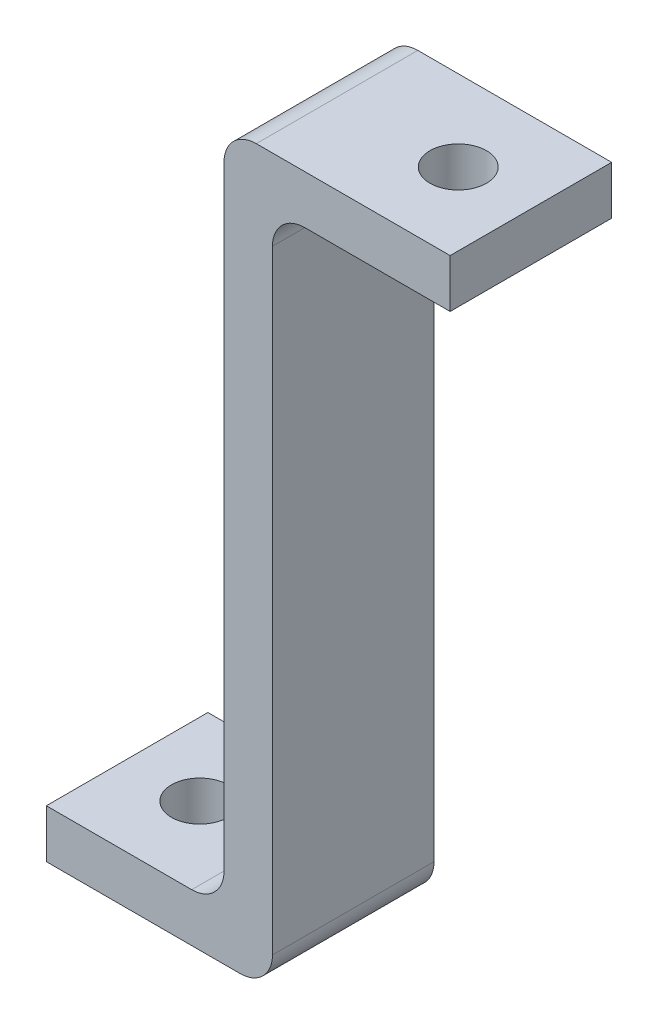
ISO-10303-21;
HEADER;
FILE_DESCRIPTION(('STEP AP214'),'2;1');
FILE_NAME('part.step','',(''),(''),'','','');
FILE_SCHEMA(('AUTOMOTIVE_DESIGN { 1 0 10303 214 1 1 1 1 }'));
ENDSEC;
DATA;
#1=APPLICATION_CONTEXT('core data for automotive mechanical design processes');
#2=APPLICATION_PROTOCOL_DEFINITION('international standard','automotive_design',2000,#1);
#3=PRODUCT_CONTEXT('',#1,'mechanical');
#4=PRODUCT('Part','Part','',(#3));
#5=PRODUCT_RELATED_PRODUCT_CATEGORY('part','',(#4));
#6=PRODUCT_DEFINITION_FORMATION('','',#4);
#7=PRODUCT_DEFINITION_CONTEXT('part definition',#1,'design');
#8=PRODUCT_DEFINITION('design','',#6,#7);
#9=PRODUCT_DEFINITION_SHAPE('','',#8);
#10=(LENGTH_UNIT() NAMED_UNIT(*) SI_UNIT(.MILLI.,.METRE.));
#11=(NAMED_UNIT(*) PLANE_ANGLE_UNIT() SI_UNIT($,.RADIAN.));
#12=(NAMED_UNIT(*) SI_UNIT($,.STERADIAN.) SOLID_ANGLE_UNIT());
#13=UNCERTAINTY_MEASURE_WITH_UNIT(LENGTH_MEASURE(1.E-05),#10,'distance_accuracy_value','');
#14=(GEOMETRIC_REPRESENTATION_CONTEXT(3) GLOBAL_UNCERTAINTY_ASSIGNED_CONTEXT((#13)) GLOBAL_UNIT_ASSIGNED_CONTEXT((#10,
#11,#12)) REPRESENTATION_CONTEXT('',''));
#15=CARTESIAN_POINT('',(0.,0.,0.));
#16=DIRECTION('',(0.,0.,1.));
#17=DIRECTION('',(1.,0.,0.));
#18=AXIS2_PLACEMENT_3D('',#15,#16,#17);
#19=CARTESIAN_POINT('',(0.,3.,-10.));
#20=DIRECTION('',(-1.,0.,0.));
#21=DIRECTION('',(0.,-1.,0.));
#22=AXIS2_PLACEMENT_3D('',#19,#20,#21);
#23=PLANE('',#22);
#24=DIRECTION('',(0.,-1.,0.));
#25=VECTOR('',#24,1.);
#26=CARTESIAN_POINT('',(0.,3.,0.));
#27=LINE('',#26,#25);
#28=CARTESIAN_POINT('',(0.,3.,0.));
#29=VERTEX_POINT('',#28);
#30=CARTESIAN_POINT('',(0.,0.,0.));
#31=VERTEX_POINT('',#30);
#32=EDGE_CURVE('E189',#29,#31,#27,.T.);
#33=ORIENTED_EDGE('',*,*,#32,.F.);
#34=DIRECTION('',(0.,0.,1.));
#35=VECTOR('',#34,1.);
#36=CARTESIAN_POINT('',(0.,3.,-10.));
#37=LINE('',#36,#35);
#38=CARTESIAN_POINT('',(0.,3.,-10.));
#39=VERTEX_POINT('',#38);
#40=EDGE_CURVE('E159',#39,#29,#37,.T.);
#41=ORIENTED_EDGE('',*,*,#40,.F.);
#42=DIRECTION('',(0.,-1.,0.));
#43=VECTOR('',#42,1.);
#44=CARTESIAN_POINT('',(0.,3.,-10.));
#45=LINE('',#44,#43);
#46=CARTESIAN_POINT('',(0.,0.,-10.));
#47=VERTEX_POINT('',#46);
#48=EDGE_CURVE('E151',#39,#47,#45,.T.);
#49=ORIENTED_EDGE('',*,*,#48,.T.);
#50=DIRECTION('',(0.,0.,1.));
#51=VECTOR('',#50,1.);
#52=CARTESIAN_POINT('',(0.,0.,-10.));
#53=LINE('',#52,#51);
#54=EDGE_CURVE('E131',#47,#31,#53,.T.);
#55=ORIENTED_EDGE('',*,*,#54,.T.);
#56=EDGE_LOOP('',(#33,#41,#49,#55));
#57=FACE_BOUND('',#56,.T.);
#58=ADVANCED_FACE('F39',(#57),#23,.T.);
#59=CARTESIAN_POINT('',(11.,3.,-10.));
#60=DIRECTION('',(0.,1.,0.));
#61=DIRECTION('',(-1.,0.,0.));
#62=AXIS2_PLACEMENT_3D('',#59,#60,#61);
#63=PLANE('',#62);
#64=CARTESIAN_POINT('',(4.5,3.,-5.));
#65=DIRECTION('',(0.,1.,0.));
#66=DIRECTION('',(-1.,0.,0.));
#67=AXIS2_PLACEMENT_3D('',#64,#65,#66);
#68=CIRCLE('',#67,1.75);
#69=CARTESIAN_POINT('',(2.75,3.,-5.));
#70=VERTEX_POINT('',#69);
#71=EDGE_CURVE('E167',#70,#70,#68,.T.);
#72=ORIENTED_EDGE('',*,*,#71,.F.);
#73=EDGE_LOOP('',(#72));
#74=FACE_BOUND('',#73,.T.);
#75=DIRECTION('',(-1.,0.,0.));
#76=VECTOR('',#75,1.);
#77=CARTESIAN_POINT('',(11.,3.,0.));
#78=LINE('',#77,#76);
#79=CARTESIAN_POINT('',(9.,3.,0.));
#80=VERTEX_POINT('',#79);
#81=EDGE_CURVE('E161',#80,#29,#78,.T.);
#82=ORIENTED_EDGE('',*,*,#81,.F.);
#83=DIRECTION('',(0.,0.,1.));
#84=VECTOR('',#83,1.);
#85=CARTESIAN_POINT('',(9.,3.,-10.));
#86=LINE('',#85,#84);
#87=CARTESIAN_POINT('',(9.,3.,-10.));
#88=VERTEX_POINT('',#87);
#89=EDGE_CURVE('E251',#80,#88,#86,.F.);
#90=ORIENTED_EDGE('',*,*,#89,.T.);
#91=DIRECTION('',(-1.,0.,0.));
#92=VECTOR('',#91,1.);
#93=CARTESIAN_POINT('',(11.,3.,-10.));
#94=LINE('',#93,#92);
#95=EDGE_CURVE('E145',#88,#39,#94,.T.);
#96=ORIENTED_EDGE('',*,*,#95,.T.);
#97=ORIENTED_EDGE('',*,*,#40,.T.);
#98=EDGE_LOOP('',(#82,#90,#96,#97));
#99=FACE_BOUND('',#98,.T.);
#100=ADVANCED_FACE('F280',(#74,#99),#63,.T.);
#101=CARTESIAN_POINT('',(11.,45.,-10.));
#102=DIRECTION('',(-1.,0.,0.));
#103=DIRECTION('',(0.,-1.,0.));
#104=AXIS2_PLACEMENT_3D('',#101,#102,#103);
#105=PLANE('',#104);
#106=DIRECTION('',(0.,-1.,0.));
#107=VECTOR('',#106,1.);
#108=CARTESIAN_POINT('',(11.,45.,0.));
#109=LINE('',#108,#107);
#110=CARTESIAN_POINT('',(11.,43.,0.));
#111=VERTEX_POINT('',#110);
#112=CARTESIAN_POINT('',(11.,5.00000000000001,0.));
#113=VERTEX_POINT('',#112);
#114=EDGE_CURVE('E164',#111,#113,#109,.T.);
#115=ORIENTED_EDGE('',*,*,#114,.F.);
#116=DIRECTION('',(0.,0.,1.));
#117=VECTOR('',#116,1.);
#118=CARTESIAN_POINT('',(11.,43.,-10.));
#119=LINE('',#118,#117);
#120=CARTESIAN_POINT('',(11.,43.,-10.));
#121=VERTEX_POINT('',#120);
#122=EDGE_CURVE('E248',#111,#121,#119,.F.);
#123=ORIENTED_EDGE('',*,*,#122,.T.);
#124=DIRECTION('',(0.,-1.,0.));
#125=VECTOR('',#124,1.);
#126=CARTESIAN_POINT('',(11.,45.,-10.));
#127=LINE('',#126,#125);
#128=CARTESIAN_POINT('',(11.,5.00000000000001,-10.));
#129=VERTEX_POINT('',#128);
#130=EDGE_CURVE('E183',#121,#129,#127,.T.);
#131=ORIENTED_EDGE('',*,*,#130,.T.);
#132=DIRECTION('',(0.,0.,1.));
#133=VECTOR('',#132,1.);
#134=CARTESIAN_POINT('',(11.,5.,0.));
#135=LINE('',#134,#133);
#136=EDGE_CURVE('E244',#129,#113,#135,.T.);
#137=ORIENTED_EDGE('',*,*,#136,.T.);
#138=EDGE_LOOP('',(#115,#123,#131,#137));
#139=FACE_BOUND('',#138,.T.);
#140=ADVANCED_FACE('F287',(#139),#105,.T.);
#141=CARTESIAN_POINT('',(25.,45.,-10.));
#142=DIRECTION('',(0.,1.,0.));
#143=DIRECTION('',(-1.,0.,0.));
#144=AXIS2_PLACEMENT_3D('',#141,#142,#143);
#145=PLANE('',#144);
#146=CARTESIAN_POINT('',(20.5,45.,-5.));
#147=DIRECTION('',(0.,1.,0.));
#148=DIRECTION('',(0.,0.,1.));
#149=AXIS2_PLACEMENT_3D('',#146,#147,#148);
#150=CIRCLE('',#149,1.74999999999999);
#151=CARTESIAN_POINT('',(20.5,45.,-3.25000000000001));
#152=VERTEX_POINT('',#151);
#153=EDGE_CURVE('E441',#152,#152,#150,.T.);
#154=ORIENTED_EDGE('',*,*,#153,.F.);
#155=EDGE_LOOP('',(#154));
#156=FACE_BOUND('',#155,.T.);
#157=DIRECTION('',(-1.,0.,0.));
#158=VECTOR('',#157,1.);
#159=CARTESIAN_POINT('',(25.,45.,-10.));
#160=LINE('',#159,#158);
#161=CARTESIAN_POINT('',(25.,45.,-10.));
#162=VERTEX_POINT('',#161);
#163=CARTESIAN_POINT('',(13.,45.,-10.));
#164=VERTEX_POINT('',#163);
#165=EDGE_CURVE('E180',#162,#164,#160,.T.);
#166=ORIENTED_EDGE('',*,*,#165,.T.);
#167=DIRECTION('',(0.,0.,1.));
#168=VECTOR('',#167,1.);
#169=CARTESIAN_POINT('',(13.,45.,-10.));
#170=LINE('',#169,#168);
#171=CARTESIAN_POINT('',(13.,45.,0.));
#172=VERTEX_POINT('',#171);
#173=EDGE_CURVE('E240',#164,#172,#170,.T.);
#174=ORIENTED_EDGE('',*,*,#173,.T.);
#175=DIRECTION('',(-1.,0.,0.));
#176=VECTOR('',#175,1.);
#177=CARTESIAN_POINT('',(25.,45.,0.));
#178=LINE('',#177,#176);
#179=CARTESIAN_POINT('',(25.,45.,0.));
#180=VERTEX_POINT('',#179);
#181=EDGE_CURVE('E205',#180,#172,#178,.T.);
#182=ORIENTED_EDGE('',*,*,#181,.F.);
#183=DIRECTION('',(0.,0.,1.));
#184=VECTOR('',#183,1.);
#185=CARTESIAN_POINT('',(25.,45.,-10.));
#186=LINE('',#185,#184);
#187=EDGE_CURVE('E215',#162,#180,#186,.T.);
#188=ORIENTED_EDGE('',*,*,#187,.F.);
#189=EDGE_LOOP('',(#166,#174,#182,#188));
#190=FACE_BOUND('',#189,.T.);
#191=ADVANCED_FACE('F294',(#156,#190),#145,.T.);
#192=CARTESIAN_POINT('',(25.,42.,-10.));
#193=DIRECTION('',(1.,0.,0.));
#194=DIRECTION('',(0.,1.,0.));
#195=AXIS2_PLACEMENT_3D('',#192,#193,#194);
#196=PLANE('',#195);
#197=DIRECTION('',(0.,1.,0.));
#198=VECTOR('',#197,1.);
#199=CARTESIAN_POINT('',(25.,42.,0.));
#200=LINE('',#199,#198);
#201=CARTESIAN_POINT('',(25.,42.,0.));
#202=VERTEX_POINT('',#201);
#203=EDGE_CURVE('E201',#202,#180,#200,.T.);
#204=ORIENTED_EDGE('',*,*,#203,.F.);
#205=DIRECTION('',(0.,0.,1.));
#206=VECTOR('',#205,1.);
#207=CARTESIAN_POINT('',(25.,42.,-10.));
#208=LINE('',#207,#206);
#209=CARTESIAN_POINT('',(25.,42.,-10.));
#210=VERTEX_POINT('',#209);
#211=EDGE_CURVE('E144',#210,#202,#208,.T.);
#212=ORIENTED_EDGE('',*,*,#211,.F.);
#213=DIRECTION('',(0.,1.,0.));
#214=VECTOR('',#213,1.);
#215=CARTESIAN_POINT('',(25.,42.,-10.));
#216=LINE('',#215,#214);
#217=EDGE_CURVE('E176',#210,#162,#216,.T.);
#218=ORIENTED_EDGE('',*,*,#217,.T.);
#219=ORIENTED_EDGE('',*,*,#187,.T.);
#220=EDGE_LOOP('',(#204,#212,#218,#219));
#221=FACE_BOUND('',#220,.T.);
#222=ADVANCED_FACE('F296',(#221),#196,.T.);
#223=CARTESIAN_POINT('',(14.,42.,-10.));
#224=DIRECTION('',(0.,-1.,0.));
#225=DIRECTION('',(0.,0.,-1.));
#226=AXIS2_PLACEMENT_3D('',#223,#224,#225);
#227=PLANE('',#226);
#228=CARTESIAN_POINT('',(20.5,42.,-5.));
#229=DIRECTION('',(0.,-1.,0.));
#230=DIRECTION('',(0.,0.,-1.));
#231=AXIS2_PLACEMENT_3D('',#228,#229,#230);
#232=CIRCLE('',#231,1.74999999999999);
#233=CARTESIAN_POINT('',(20.5,42.,-6.74999999999999));
#234=VERTEX_POINT('',#233);
#235=EDGE_CURVE('E437',#234,#234,#232,.T.);
#236=ORIENTED_EDGE('',*,*,#235,.F.);
#237=EDGE_LOOP('',(#236));
#238=FACE_BOUND('',#237,.T.);
#239=DIRECTION('',(1.,0.,0.));
#240=VECTOR('',#239,1.);
#241=CARTESIAN_POINT('',(14.,42.,0.));
#242=LINE('',#241,#240);
#243=CARTESIAN_POINT('',(16.,42.,0.));
#244=VERTEX_POINT('',#243);
#245=EDGE_CURVE('E198',#244,#202,#242,.T.);
#246=ORIENTED_EDGE('',*,*,#245,.F.);
#247=DIRECTION('',(0.,0.,1.));
#248=VECTOR('',#247,1.);
#249=CARTESIAN_POINT('',(16.,42.,-10.));
#250=LINE('',#249,#248);
#251=CARTESIAN_POINT('',(16.,42.,-10.));
#252=VERTEX_POINT('',#251);
#253=EDGE_CURVE('E55',#244,#252,#250,.F.);
#254=ORIENTED_EDGE('',*,*,#253,.T.);
#255=DIRECTION('',(1.,0.,0.));
#256=VECTOR('',#255,1.);
#257=CARTESIAN_POINT('',(14.,42.,-10.));
#258=LINE('',#257,#256);
#259=EDGE_CURVE('E173',#252,#210,#258,.T.);
#260=ORIENTED_EDGE('',*,*,#259,.T.);
#261=ORIENTED_EDGE('',*,*,#211,.T.);
#262=EDGE_LOOP('',(#246,#254,#260,#261));
#263=FACE_BOUND('',#262,.T.);
#264=ADVANCED_FACE('F267',(#238,#263),#227,.T.);
#265=CARTESIAN_POINT('',(14.,0.,-10.));
#266=DIRECTION('',(1.,0.,0.));
#267=DIRECTION('',(0.,0.,-1.));
#268=AXIS2_PLACEMENT_3D('',#265,#266,#267);
#269=PLANE('',#268);
#270=DIRECTION('',(0.,1.,0.));
#271=VECTOR('',#270,1.);
#272=CARTESIAN_POINT('',(14.,0.,0.));
#273=LINE('',#272,#271);
#274=CARTESIAN_POINT('',(14.,2.,0.));
#275=VERTEX_POINT('',#274);
#276=CARTESIAN_POINT('',(14.,40.,0.));
#277=VERTEX_POINT('',#276);
#278=EDGE_CURVE('E194',#275,#277,#273,.T.);
#279=ORIENTED_EDGE('',*,*,#278,.F.);
#280=DIRECTION('',(0.,0.,1.));
#281=VECTOR('',#280,1.);
#282=CARTESIAN_POINT('',(14.,2.,-10.));
#283=LINE('',#282,#281);
#284=CARTESIAN_POINT('',(14.,2.,-10.));
#285=VERTEX_POINT('',#284);
#286=EDGE_CURVE('E233',#275,#285,#283,.F.);
#287=ORIENTED_EDGE('',*,*,#286,.T.);
#288=DIRECTION('',(0.,1.,0.));
#289=VECTOR('',#288,1.);
#290=CARTESIAN_POINT('',(14.,0.,-10.));
#291=LINE('',#290,#289);
#292=CARTESIAN_POINT('',(14.,40.,-10.));
#293=VERTEX_POINT('',#292);
#294=EDGE_CURVE('E155',#285,#293,#291,.T.);
#295=ORIENTED_EDGE('',*,*,#294,.T.);
#296=DIRECTION('',(0.,0.,1.));
#297=VECTOR('',#296,1.);
#298=CARTESIAN_POINT('',(14.,40.,0.));
#299=LINE('',#298,#297);
#300=EDGE_CURVE('E229',#293,#277,#299,.T.);
#301=ORIENTED_EDGE('',*,*,#300,.T.);
#302=EDGE_LOOP('',(#279,#287,#295,#301));
#303=FACE_BOUND('',#302,.T.);
#304=ADVANCED_FACE('F273',(#303),#269,.T.);
#305=CARTESIAN_POINT('',(0.,0.,-10.));
#306=DIRECTION('',(0.,-1.,0.));
#307=DIRECTION('',(0.,0.,-1.));
#308=AXIS2_PLACEMENT_3D('',#305,#306,#307);
#309=PLANE('',#308);
#310=CARTESIAN_POINT('',(4.5,0.,-5.));
#311=DIRECTION('',(0.,-1.,0.));
#312=DIRECTION('',(0.,0.,-1.));
#313=AXIS2_PLACEMENT_3D('',#310,#311,#312);
#314=CIRCLE('',#313,1.75);
#315=CARTESIAN_POINT('',(4.5,0.,-6.75));
#316=VERTEX_POINT('',#315);
#317=EDGE_CURVE('E435',#316,#316,#314,.T.);
#318=ORIENTED_EDGE('',*,*,#317,.F.);
#319=EDGE_LOOP('',(#318));
#320=FACE_BOUND('',#319,.T.);
#321=DIRECTION('',(1.,0.,0.));
#322=VECTOR('',#321,1.);
#323=CARTESIAN_POINT('',(0.,0.,-10.));
#324=LINE('',#323,#322);
#325=CARTESIAN_POINT('',(12.,0.,-10.));
#326=VERTEX_POINT('',#325);
#327=EDGE_CURVE('E135',#47,#326,#324,.T.);
#328=ORIENTED_EDGE('',*,*,#327,.T.);
#329=DIRECTION('',(0.,0.,1.));
#330=VECTOR('',#329,1.);
#331=CARTESIAN_POINT('',(12.,0.,-10.));
#332=LINE('',#331,#330);
#333=CARTESIAN_POINT('',(12.,0.,0.));
#334=VERTEX_POINT('',#333);
#335=EDGE_CURVE('E214',#326,#334,#332,.T.);
#336=ORIENTED_EDGE('',*,*,#335,.T.);
#337=DIRECTION('',(1.,0.,0.));
#338=VECTOR('',#337,1.);
#339=CARTESIAN_POINT('',(0.,0.,0.));
#340=LINE('',#339,#338);
#341=EDGE_CURVE('E138',#31,#334,#340,.T.);
#342=ORIENTED_EDGE('',*,*,#341,.F.);
#343=ORIENTED_EDGE('',*,*,#54,.F.);
#344=EDGE_LOOP('',(#328,#336,#342,#343));
#345=FACE_BOUND('',#344,.T.);
#346=ADVANCED_FACE('F133',(#320,#345),#309,.T.);
#347=CARTESIAN_POINT('',(0.,0.,-10.));
#348=DIRECTION('',(0.,0.,1.));
#349=DIRECTION('',(1.,0.,0.));
#350=AXIS2_PLACEMENT_3D('',#347,#348,#349);
#351=PLANE('',#350);
#352=ORIENTED_EDGE('',*,*,#294,.F.);
#353=CARTESIAN_POINT('',(12.,2.,-10.));
#354=DIRECTION('',(0.,0.,1.));
#355=DIRECTION('',(1.,0.,0.));
#356=AXIS2_PLACEMENT_3D('',#353,#354,#355);
#357=CIRCLE('',#356,2.);
#358=EDGE_CURVE('E153',#285,#326,#357,.F.);
#359=ORIENTED_EDGE('',*,*,#358,.T.);
#360=ORIENTED_EDGE('',*,*,#327,.F.);
#361=ORIENTED_EDGE('',*,*,#48,.F.);
#362=ORIENTED_EDGE('',*,*,#95,.F.);
#363=CARTESIAN_POINT('',(9.,5.,-10.));
#364=DIRECTION('',(0.,0.,1.));
#365=DIRECTION('',(1.,0.,0.));
#366=AXIS2_PLACEMENT_3D('',#363,#364,#365);
#367=CIRCLE('',#366,2.);
#368=EDGE_CURVE('E259',#88,#129,#367,.T.);
#369=ORIENTED_EDGE('',*,*,#368,.T.);
#370=ORIENTED_EDGE('',*,*,#130,.F.);
#371=CARTESIAN_POINT('',(13.,43.,-10.));
#372=DIRECTION('',(0.,0.,1.));
#373=DIRECTION('',(1.,0.,0.));
#374=AXIS2_PLACEMENT_3D('',#371,#372,#373);
#375=CIRCLE('',#374,2.);
#376=EDGE_CURVE('E63',#121,#164,#375,.F.);
#377=ORIENTED_EDGE('',*,*,#376,.T.);
#378=ORIENTED_EDGE('',*,*,#165,.F.);
#379=ORIENTED_EDGE('',*,*,#217,.F.);
#380=ORIENTED_EDGE('',*,*,#259,.F.);
#381=CARTESIAN_POINT('',(16.,40.,-10.));
#382=DIRECTION('',(0.,0.,1.));
#383=DIRECTION('',(1.,0.,0.));
#384=AXIS2_PLACEMENT_3D('',#381,#382,#383);
#385=CIRCLE('',#384,2.);
#386=EDGE_CURVE('E11',#252,#293,#385,.T.);
#387=ORIENTED_EDGE('',*,*,#386,.T.);
#388=EDGE_LOOP('',(#352,#359,#360,#361,#362,#369,#370,#377,#378,#379,#380,#387));
#389=FACE_BOUND('',#388,.T.);
#390=ADVANCED_FACE('F149',(#389),#351,.F.);
#391=CARTESIAN_POINT('',(0.,0.,0.));
#392=DIRECTION('',(0.,0.,1.));
#393=DIRECTION('',(1.,0.,0.));
#394=AXIS2_PLACEMENT_3D('',#391,#392,#393);
#395=PLANE('',#394);
#396=ORIENTED_EDGE('',*,*,#341,.T.);
#397=CARTESIAN_POINT('',(12.,2.,0.));
#398=DIRECTION('',(0.,0.,1.));
#399=DIRECTION('',(1.,0.,0.));
#400=AXIS2_PLACEMENT_3D('',#397,#398,#399);
#401=CIRCLE('',#400,2.);
#402=EDGE_CURVE('E226',#334,#275,#401,.T.);
#403=ORIENTED_EDGE('',*,*,#402,.T.);
#404=ORIENTED_EDGE('',*,*,#278,.T.);
#405=CARTESIAN_POINT('',(16.,40.,0.));
#406=DIRECTION('',(0.,0.,1.));
#407=DIRECTION('',(1.,0.,0.));
#408=AXIS2_PLACEMENT_3D('',#405,#406,#407);
#409=CIRCLE('',#408,2.);
#410=EDGE_CURVE('E48',#277,#244,#409,.F.);
#411=ORIENTED_EDGE('',*,*,#410,.T.);
#412=ORIENTED_EDGE('',*,*,#245,.T.);
#413=ORIENTED_EDGE('',*,*,#203,.T.);
#414=ORIENTED_EDGE('',*,*,#181,.T.);
#415=CARTESIAN_POINT('',(13.,43.,0.));
#416=DIRECTION('',(0.,0.,1.));
#417=DIRECTION('',(1.,0.,0.));
#418=AXIS2_PLACEMENT_3D('',#415,#416,#417);
#419=CIRCLE('',#418,2.);
#420=EDGE_CURVE('E223',#172,#111,#419,.T.);
#421=ORIENTED_EDGE('',*,*,#420,.T.);
#422=ORIENTED_EDGE('',*,*,#114,.T.);
#423=CARTESIAN_POINT('',(9.,5.,0.));
#424=DIRECTION('',(0.,0.,1.));
#425=DIRECTION('',(1.,0.,0.));
#426=AXIS2_PLACEMENT_3D('',#423,#424,#425);
#427=CIRCLE('',#426,2.);
#428=EDGE_CURVE('E256',#113,#80,#427,.F.);
#429=ORIENTED_EDGE('',*,*,#428,.T.);
#430=ORIENTED_EDGE('',*,*,#81,.T.);
#431=ORIENTED_EDGE('',*,*,#32,.T.);
#432=EDGE_LOOP('',(#396,#403,#404,#411,#412,#413,#414,#421,#422,#429,#430,#431));
#433=FACE_BOUND('',#432,.T.);
#434=ADVANCED_FACE('F263',(#433),#395,.T.);
#435=CARTESIAN_POINT('',(12.,2.,-10.));
#436=DIRECTION('',(0.,0.,1.));
#437=DIRECTION('',(1.,0.,0.));
#438=AXIS2_PLACEMENT_3D('',#435,#436,#437);
#439=CYLINDRICAL_SURFACE('',#438,2.);
#440=ORIENTED_EDGE('',*,*,#358,.F.);
#441=ORIENTED_EDGE('',*,*,#286,.F.);
#442=ORIENTED_EDGE('',*,*,#402,.F.);
#443=ORIENTED_EDGE('',*,*,#335,.F.);
#444=EDGE_LOOP('',(#440,#441,#442,#443));
#445=FACE_BOUND('',#444,.T.);
#446=ADVANCED_FACE('F276',(#445),#439,.T.);
#447=CARTESIAN_POINT('',(13.,43.,-10.));
#448=DIRECTION('',(0.,0.,1.));
#449=DIRECTION('',(1.,0.,0.));
#450=AXIS2_PLACEMENT_3D('',#447,#448,#449);
#451=CYLINDRICAL_SURFACE('',#450,2.);
#452=ORIENTED_EDGE('',*,*,#376,.F.);
#453=ORIENTED_EDGE('',*,*,#122,.F.);
#454=ORIENTED_EDGE('',*,*,#420,.F.);
#455=ORIENTED_EDGE('',*,*,#173,.F.);
#456=EDGE_LOOP('',(#452,#453,#454,#455));
#457=FACE_BOUND('',#456,.T.);
#458=ADVANCED_FACE('F292',(#457),#451,.T.);
#459=CARTESIAN_POINT('',(9.,5.,-10.));
#460=DIRECTION('',(0.,0.,-1.));
#461=DIRECTION('',(-1.,0.,0.));
#462=AXIS2_PLACEMENT_3D('',#459,#460,#461);
#463=CYLINDRICAL_SURFACE('',#462,2.);
#464=ORIENTED_EDGE('',*,*,#368,.F.);
#465=ORIENTED_EDGE('',*,*,#89,.F.);
#466=ORIENTED_EDGE('',*,*,#428,.F.);
#467=ORIENTED_EDGE('',*,*,#136,.F.);
#468=EDGE_LOOP('',(#464,#465,#466,#467));
#469=FACE_BOUND('',#468,.T.);
#470=ADVANCED_FACE('F284',(#469),#463,.F.);
#471=CARTESIAN_POINT('',(16.,40.,-10.));
#472=DIRECTION('',(0.,0.,-1.));
#473=DIRECTION('',(-1.,0.,0.));
#474=AXIS2_PLACEMENT_3D('',#471,#472,#473);
#475=CYLINDRICAL_SURFACE('',#474,2.);
#476=ORIENTED_EDGE('',*,*,#386,.F.);
#477=ORIENTED_EDGE('',*,*,#253,.F.);
#478=ORIENTED_EDGE('',*,*,#410,.F.);
#479=ORIENTED_EDGE('',*,*,#300,.F.);
#480=EDGE_LOOP('',(#476,#477,#478,#479));
#481=FACE_BOUND('',#480,.T.);
#482=ADVANCED_FACE('F41',(#481),#475,.F.);
#483=CARTESIAN_POINT('',(4.5,0.,-5.));
#484=DIRECTION('',(0.,-1.,0.));
#485=DIRECTION('',(0.,0.,-1.));
#486=AXIS2_PLACEMENT_3D('',#483,#484,#485);
#487=CYLINDRICAL_SURFACE('',#486,1.75);
#488=ORIENTED_EDGE('',*,*,#71,.T.);
#489=EDGE_LOOP('',(#488));
#490=FACE_BOUND('',#489,.T.);
#491=ORIENTED_EDGE('',*,*,#317,.T.);
#492=EDGE_LOOP('',(#491));
#493=FACE_BOUND('',#492,.T.);
#494=ADVANCED_FACE('F324',(#490,#493),#487,.F.);
#495=CARTESIAN_POINT('',(20.5,45.,-5.));
#496=DIRECTION('',(0.,1.,0.));
#497=DIRECTION('',(0.,0.,1.));
#498=AXIS2_PLACEMENT_3D('',#495,#496,#497);
#499=CYLINDRICAL_SURFACE('',#498,1.74999999999999);
#500=ORIENTED_EDGE('',*,*,#235,.T.);
#501=EDGE_LOOP('',(#500));
#502=FACE_BOUND('',#501,.T.);
#503=ORIENTED_EDGE('',*,*,#153,.T.);
#504=EDGE_LOOP('',(#503));
#505=FACE_BOUND('',#504,.T.);
#506=ADVANCED_FACE('F328',(#502,#505),#499,.F.);
#507=CLOSED_SHELL('',(#58,#100,#140,#191,#222,#264,#304,#346,#390,#434,#446,#458,#470,#482,#494,#506));
#508=MANIFOLD_SOLID_BREP('B2',#507);
#509=ADVANCED_BREP_SHAPE_REPRESENTATION('',(#18,#508),#14);
#510=SHAPE_DEFINITION_REPRESENTATION(#9,#509);
ENDSEC;
END-ISO-10303-21;
